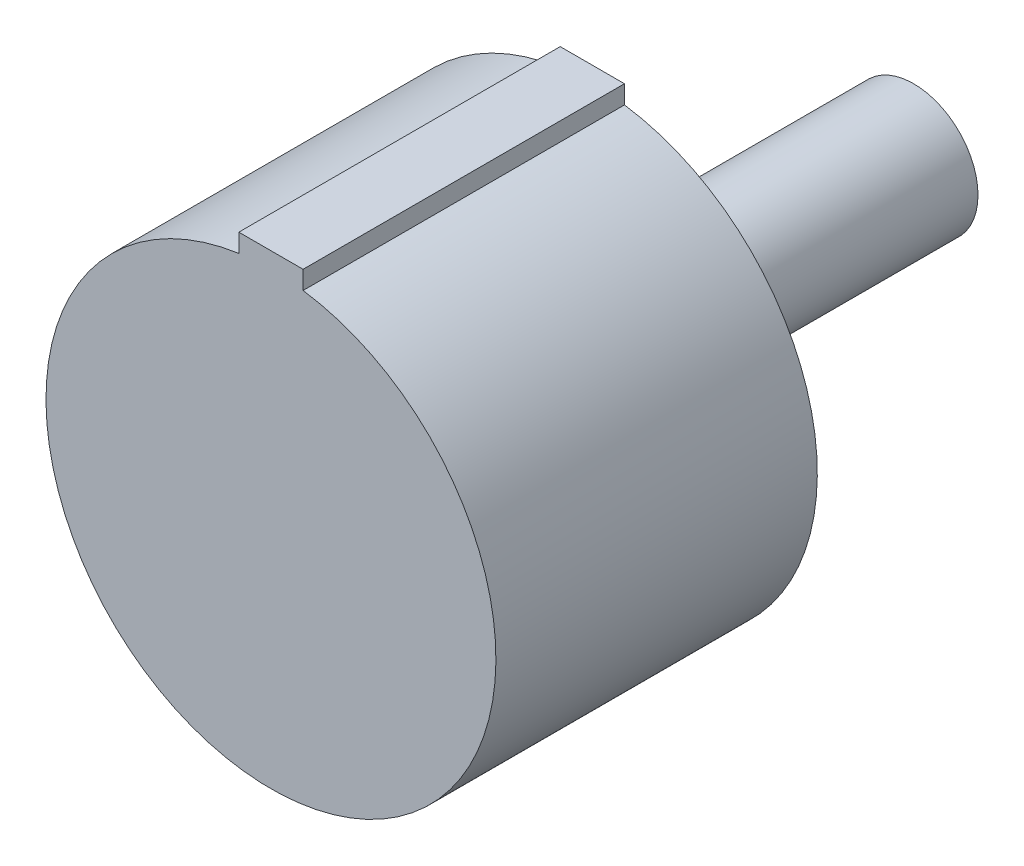
ISO-10303-21;
HEADER;
FILE_DESCRIPTION(('STEP AP214'),'2;1');
FILE_NAME('part.step','',(''),(''),'','','');
FILE_SCHEMA(('AUTOMOTIVE_DESIGN { 1 0 10303 214 1 1 1 1 }'));
ENDSEC;
DATA;
#1=APPLICATION_CONTEXT('core data for automotive mechanical design processes');
#2=APPLICATION_PROTOCOL_DEFINITION('international standard','automotive_design',2000,#1);
#3=PRODUCT_CONTEXT('',#1,'mechanical');
#4=PRODUCT('Part','Part','',(#3));
#5=PRODUCT_RELATED_PRODUCT_CATEGORY('part','',(#4));
#6=PRODUCT_DEFINITION_FORMATION('','',#4);
#7=PRODUCT_DEFINITION_CONTEXT('part definition',#1,'design');
#8=PRODUCT_DEFINITION('design','',#6,#7);
#9=PRODUCT_DEFINITION_SHAPE('','',#8);
#10=(LENGTH_UNIT() NAMED_UNIT(*) SI_UNIT(.MILLI.,.METRE.));
#11=(NAMED_UNIT(*) PLANE_ANGLE_UNIT() SI_UNIT($,.RADIAN.));
#12=(NAMED_UNIT(*) SI_UNIT($,.STERADIAN.) SOLID_ANGLE_UNIT());
#13=UNCERTAINTY_MEASURE_WITH_UNIT(LENGTH_MEASURE(1.E-05),#10,'distance_accuracy_value','');
#14=(GEOMETRIC_REPRESENTATION_CONTEXT(3) GLOBAL_UNCERTAINTY_ASSIGNED_CONTEXT((#13)) GLOBAL_UNIT_ASSIGNED_CONTEXT((#10,
#11,#12)) REPRESENTATION_CONTEXT('',''));
#15=CARTESIAN_POINT('',(0.,0.,0.));
#16=DIRECTION('',(0.,0.,1.));
#17=DIRECTION('',(1.,0.,0.));
#18=AXIS2_PLACEMENT_3D('',#15,#16,#17);
#19=CARTESIAN_POINT('',(0.,0.,40.));
#20=DIRECTION('',(0.,0.,-1.));
#21=DIRECTION('',(-1.,0.,0.));
#22=AXIS2_PLACEMENT_3D('',#19,#20,#21);
#23=CYLINDRICAL_SURFACE('',#22,4.);
#24=CARTESIAN_POINT('',(0.,0.,0.));
#25=DIRECTION('',(0.,0.,1.));
#26=DIRECTION('',(1.,0.,0.));
#27=AXIS2_PLACEMENT_3D('',#24,#25,#26);
#28=CIRCLE('',#27,4.);
#29=CARTESIAN_POINT('',(4.,0.,0.));
#30=VERTEX_POINT('',#29);
#31=EDGE_CURVE('E41',#30,#30,#28,.T.);
#32=ORIENTED_EDGE('',*,*,#31,.T.);
#33=EDGE_LOOP('',(#32));
#34=FACE_BOUND('',#33,.T.);
#35=CARTESIAN_POINT('',(0.,0.,20.));
#36=DIRECTION('',(0.,0.,1.));
#37=DIRECTION('',(1.,0.,0.));
#38=AXIS2_PLACEMENT_3D('',#35,#36,#37);
#39=CIRCLE('',#38,4.);
#40=CARTESIAN_POINT('',(4.,0.,20.));
#41=VERTEX_POINT('',#40);
#42=EDGE_CURVE('E11',#41,#41,#39,.T.);
#43=ORIENTED_EDGE('',*,*,#42,.F.);
#44=EDGE_LOOP('',(#43));
#45=FACE_BOUND('',#44,.T.);
#46=ADVANCED_FACE('F33',(#34,#45),#23,.T.);
#47=CARTESIAN_POINT('',(0.,0.,0.));
#48=DIRECTION('',(0.,0.,1.));
#49=DIRECTION('',(1.,0.,0.));
#50=AXIS2_PLACEMENT_3D('',#47,#48,#49);
#51=PLANE('',#50);
#52=ORIENTED_EDGE('',*,*,#31,.F.);
#53=EDGE_LOOP('',(#52));
#54=FACE_BOUND('',#53,.T.);
#55=ADVANCED_FACE('F116',(#54),#51,.F.);
#56=CARTESIAN_POINT('',(0.,0.,20.));
#57=DIRECTION('',(0.,0.,1.));
#58=DIRECTION('',(1.,0.,0.));
#59=AXIS2_PLACEMENT_3D('',#56,#57,#58);
#60=PLANE('',#59);
#61=CARTESIAN_POINT('',(0.,0.,20.));
#62=DIRECTION('',(0.,0.,1.));
#63=DIRECTION('',(1.,0.,0.));
#64=AXIS2_PLACEMENT_3D('',#61,#62,#63);
#65=CIRCLE('',#64,14.);
#66=CARTESIAN_POINT('',(-2.,13.856406460551,20.));
#67=VERTEX_POINT('',#66);
#68=CARTESIAN_POINT('',(2.,13.856406460551,20.));
#69=VERTEX_POINT('',#68);
#70=EDGE_CURVE('E95',#67,#69,#65,.T.);
#71=ORIENTED_EDGE('',*,*,#70,.F.);
#72=DIRECTION('',(0.,-1.,0.));
#73=VECTOR('',#72,1.);
#74=CARTESIAN_POINT('',(-2.,13.856406460551,20.));
#75=LINE('',#74,#73);
#76=CARTESIAN_POINT('',(-2.,15.,20.));
#77=VERTEX_POINT('',#76);
#78=EDGE_CURVE('E92',#77,#67,#75,.T.);
#79=ORIENTED_EDGE('',*,*,#78,.F.);
#80=DIRECTION('',(-1.,0.,0.));
#81=VECTOR('',#80,1.);
#82=CARTESIAN_POINT('',(-2.,15.,20.));
#83=LINE('',#82,#81);
#84=CARTESIAN_POINT('',(2.,15.,20.));
#85=VERTEX_POINT('',#84);
#86=EDGE_CURVE('E83',#85,#77,#83,.T.);
#87=ORIENTED_EDGE('',*,*,#86,.F.);
#88=DIRECTION('',(0.,1.,0.));
#89=VECTOR('',#88,1.);
#90=CARTESIAN_POINT('',(2.,15.,20.));
#91=LINE('',#90,#89);
#92=EDGE_CURVE('E91',#69,#85,#91,.T.);
#93=ORIENTED_EDGE('',*,*,#92,.F.);
#94=EDGE_LOOP('',(#71,#79,#87,#93));
#95=FACE_BOUND('',#94,.T.);
#96=ORIENTED_EDGE('',*,*,#42,.T.);
#97=EDGE_LOOP('',(#96));
#98=FACE_BOUND('',#97,.T.);
#99=ADVANCED_FACE('F89',(#95,#98),#60,.F.);
#100=CARTESIAN_POINT('',(0.,0.,20.));
#101=DIRECTION('',(0.,0.,1.));
#102=DIRECTION('',(1.,0.,0.));
#103=AXIS2_PLACEMENT_3D('',#100,#101,#102);
#104=CYLINDRICAL_SURFACE('',#103,14.);
#105=CARTESIAN_POINT('',(0.,0.,40.));
#106=DIRECTION('',(0.,0.,1.));
#107=DIRECTION('',(1.,0.,0.));
#108=AXIS2_PLACEMENT_3D('',#105,#106,#107);
#109=CIRCLE('',#108,14.);
#110=CARTESIAN_POINT('',(-2.,13.856406460551,40.));
#111=VERTEX_POINT('',#110);
#112=CARTESIAN_POINT('',(2.,13.856406460551,40.));
#113=VERTEX_POINT('',#112);
#114=EDGE_CURVE('E101',#111,#113,#109,.T.);
#115=ORIENTED_EDGE('',*,*,#114,.F.);
#116=DIRECTION('',(0.,0.,1.));
#117=VECTOR('',#116,1.);
#118=CARTESIAN_POINT('',(-2.,13.856406460551,20.));
#119=LINE('',#118,#117);
#120=EDGE_CURVE('E49',#67,#111,#119,.T.);
#121=ORIENTED_EDGE('',*,*,#120,.F.);
#122=ORIENTED_EDGE('',*,*,#70,.T.);
#123=DIRECTION('',(0.,0.,1.));
#124=VECTOR('',#123,1.);
#125=CARTESIAN_POINT('',(2.,13.856406460551,20.));
#126=LINE('',#125,#124);
#127=EDGE_CURVE('E77',#69,#113,#126,.T.);
#128=ORIENTED_EDGE('',*,*,#127,.T.);
#129=EDGE_LOOP('',(#115,#121,#122,#128));
#130=FACE_BOUND('',#129,.T.);
#131=ADVANCED_FACE('F122',(#130),#104,.T.);
#132=CARTESIAN_POINT('',(-2.,13.856406460551,20.));
#133=DIRECTION('',(-1.,0.,0.));
#134=DIRECTION('',(0.,0.,1.));
#135=AXIS2_PLACEMENT_3D('',#132,#133,#134);
#136=PLANE('',#135);
#137=DIRECTION('',(0.,-1.,0.));
#138=VECTOR('',#137,1.);
#139=CARTESIAN_POINT('',(-2.,13.856406460551,40.));
#140=LINE('',#139,#138);
#141=CARTESIAN_POINT('',(-2.,15.,40.));
#142=VERTEX_POINT('',#141);
#143=EDGE_CURVE('E97',#142,#111,#140,.T.);
#144=ORIENTED_EDGE('',*,*,#143,.F.);
#145=DIRECTION('',(0.,0.,1.));
#146=VECTOR('',#145,1.);
#147=CARTESIAN_POINT('',(-2.,15.,20.));
#148=LINE('',#147,#146);
#149=EDGE_CURVE('E66',#77,#142,#148,.T.);
#150=ORIENTED_EDGE('',*,*,#149,.F.);
#151=ORIENTED_EDGE('',*,*,#78,.T.);
#152=ORIENTED_EDGE('',*,*,#120,.T.);
#153=EDGE_LOOP('',(#144,#150,#151,#152));
#154=FACE_BOUND('',#153,.T.);
#155=ADVANCED_FACE('F132',(#154),#136,.T.);
#156=CARTESIAN_POINT('',(-2.,15.,20.));
#157=DIRECTION('',(0.,1.,0.));
#158=DIRECTION('',(0.,0.,1.));
#159=AXIS2_PLACEMENT_3D('',#156,#157,#158);
#160=PLANE('',#159);
#161=DIRECTION('',(-1.,0.,0.));
#162=VECTOR('',#161,1.);
#163=CARTESIAN_POINT('',(-2.,15.,40.));
#164=LINE('',#163,#162);
#165=CARTESIAN_POINT('',(2.,15.,40.));
#166=VERTEX_POINT('',#165);
#167=EDGE_CURVE('E85',#166,#142,#164,.T.);
#168=ORIENTED_EDGE('',*,*,#167,.F.);
#169=DIRECTION('',(0.,0.,1.));
#170=VECTOR('',#169,1.);
#171=CARTESIAN_POINT('',(2.,15.,20.));
#172=LINE('',#171,#170);
#173=EDGE_CURVE('E80',#85,#166,#172,.T.);
#174=ORIENTED_EDGE('',*,*,#173,.F.);
#175=ORIENTED_EDGE('',*,*,#86,.T.);
#176=ORIENTED_EDGE('',*,*,#149,.T.);
#177=EDGE_LOOP('',(#168,#174,#175,#176));
#178=FACE_BOUND('',#177,.T.);
#179=ADVANCED_FACE('F82',(#178),#160,.T.);
#180=CARTESIAN_POINT('',(2.,15.,20.));
#181=DIRECTION('',(1.,0.,0.));
#182=DIRECTION('',(0.,0.,-1.));
#183=AXIS2_PLACEMENT_3D('',#180,#181,#182);
#184=PLANE('',#183);
#185=DIRECTION('',(0.,1.,0.));
#186=VECTOR('',#185,1.);
#187=CARTESIAN_POINT('',(2.,15.,40.));
#188=LINE('',#187,#186);
#189=EDGE_CURVE('E104',#113,#166,#188,.T.);
#190=ORIENTED_EDGE('',*,*,#189,.F.);
#191=ORIENTED_EDGE('',*,*,#127,.F.);
#192=ORIENTED_EDGE('',*,*,#92,.T.);
#193=ORIENTED_EDGE('',*,*,#173,.T.);
#194=EDGE_LOOP('',(#190,#191,#192,#193));
#195=FACE_BOUND('',#194,.T.);
#196=ADVANCED_FACE('F94',(#195),#184,.T.);
#197=CARTESIAN_POINT('',(0.,0.,40.));
#198=DIRECTION('',(0.,0.,1.));
#199=DIRECTION('',(1.,0.,0.));
#200=AXIS2_PLACEMENT_3D('',#197,#198,#199);
#201=PLANE('',#200);
#202=ORIENTED_EDGE('',*,*,#114,.T.);
#203=ORIENTED_EDGE('',*,*,#189,.T.);
#204=ORIENTED_EDGE('',*,*,#167,.T.);
#205=ORIENTED_EDGE('',*,*,#143,.T.);
#206=EDGE_LOOP('',(#202,#203,#204,#205));
#207=FACE_BOUND('',#206,.T.);
#208=ADVANCED_FACE('F126',(#207),#201,.T.);
#209=CLOSED_SHELL('',(#46,#55,#99,#131,#155,#179,#196,#208));
#210=MANIFOLD_SOLID_BREP('B2',#209);
#211=ADVANCED_BREP_SHAPE_REPRESENTATION('',(#18,#210),#14);
#212=SHAPE_DEFINITION_REPRESENTATION(#9,#211);
ENDSEC;
END-ISO-10303-21;
